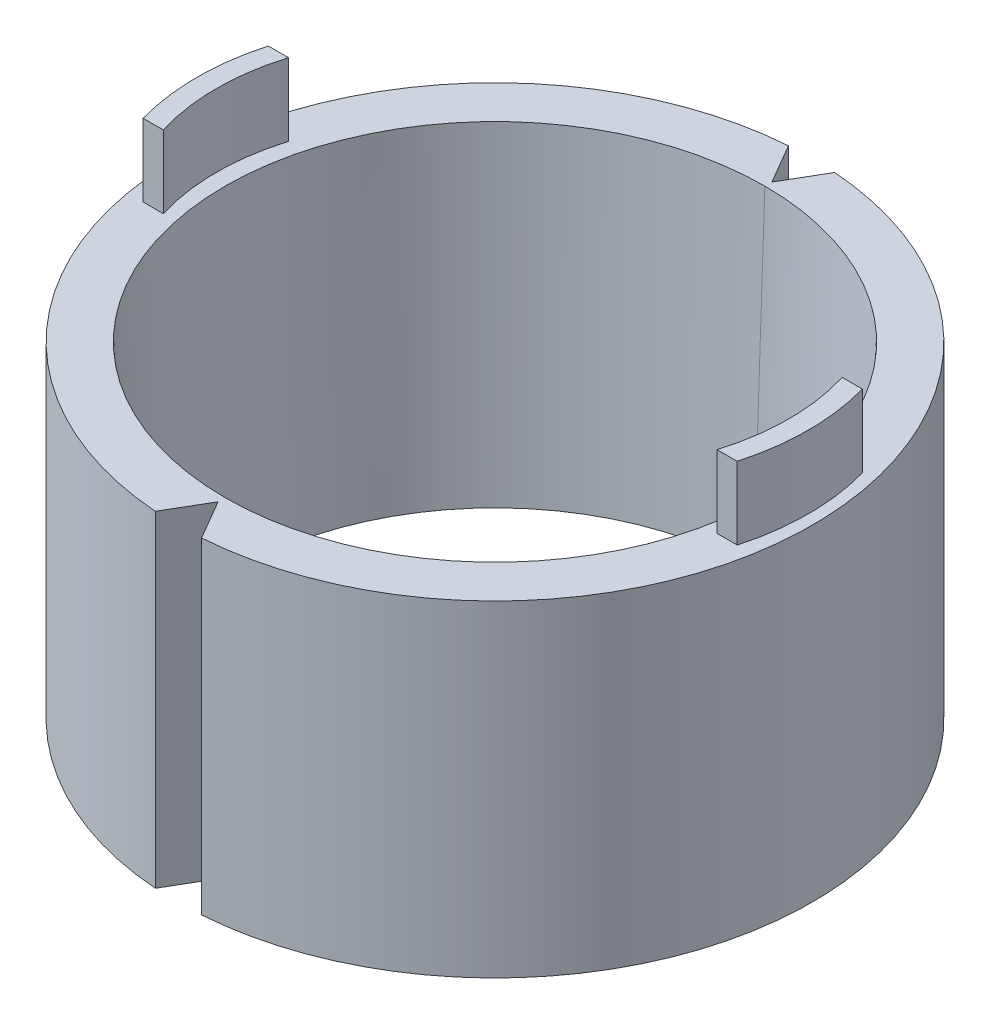
ISO-10303-21;
HEADER;
FILE_DESCRIPTION(('STEP AP214'),'2;1');
FILE_NAME('part.step','',(''),(''),'','','');
FILE_SCHEMA(('AUTOMOTIVE_DESIGN { 1 0 10303 214 1 1 1 1 }'));
ENDSEC;
DATA;
#1=APPLICATION_CONTEXT('core data for automotive mechanical design processes');
#2=APPLICATION_PROTOCOL_DEFINITION('international standard','automotive_design',2000,#1);
#3=PRODUCT_CONTEXT('',#1,'mechanical');
#4=PRODUCT('Part','Part','',(#3));
#5=PRODUCT_RELATED_PRODUCT_CATEGORY('part','',(#4));
#6=PRODUCT_DEFINITION_FORMATION('','',#4);
#7=PRODUCT_DEFINITION_CONTEXT('part definition',#1,'design');
#8=PRODUCT_DEFINITION('design','',#6,#7);
#9=PRODUCT_DEFINITION_SHAPE('','',#8);
#10=(LENGTH_UNIT() NAMED_UNIT(*) SI_UNIT(.MILLI.,.METRE.));
#11=(NAMED_UNIT(*) PLANE_ANGLE_UNIT() SI_UNIT($,.RADIAN.));
#12=(NAMED_UNIT(*) SI_UNIT($,.STERADIAN.) SOLID_ANGLE_UNIT());
#13=UNCERTAINTY_MEASURE_WITH_UNIT(LENGTH_MEASURE(1.E-05),#10,'distance_accuracy_value','');
#14=(GEOMETRIC_REPRESENTATION_CONTEXT(3) GLOBAL_UNCERTAINTY_ASSIGNED_CONTEXT((#13)) GLOBAL_UNIT_ASSIGNED_CONTEXT((#10,
#11,#12)) REPRESENTATION_CONTEXT('',''));
#15=CARTESIAN_POINT('',(0.,0.,0.));
#16=DIRECTION('',(0.,0.,1.));
#17=DIRECTION('',(1.,0.,0.));
#18=AXIS2_PLACEMENT_3D('',#15,#16,#17);
#19=CARTESIAN_POINT('',(0.,-4.,30.5339100056265));
#20=DIRECTION('',(-0.863949043618308,0.,0.50357923907863));
#21=DIRECTION('',(0.,1.,0.));
#22=AXIS2_PLACEMENT_3D('',#19,#20,#21);
#23=PLANE('',#22);
#24=DIRECTION('',(0.,1.,0.));
#25=VECTOR('',#24,1.);
#26=CARTESIAN_POINT('',(0.,-4.,30.5339100056265));
#27=LINE('',#26,#25);
#28=CARTESIAN_POINT('',(0.,0.,30.5339100056265));
#29=VERTEX_POINT('',#28);
#30=CARTESIAN_POINT('',(0.,36.,30.5339100056265));
#31=VERTEX_POINT('',#30);
#32=EDGE_CURVE('E108',#29,#31,#27,.T.);
#33=ORIENTED_EDGE('',*,*,#32,.F.);
#34=DIRECTION('',(0.50357923907863,0.,0.863949043618308));
#35=VECTOR('',#34,1.);
#36=CARTESIAN_POINT('',(0.,0.,30.5339100056265));
#37=LINE('',#36,#35);
#38=CARTESIAN_POINT('',(2.54902188416771,0.,34.9070549808207));
#39=VERTEX_POINT('',#38);
#40=EDGE_CURVE('E93',#29,#39,#37,.T.);
#41=ORIENTED_EDGE('',*,*,#40,.T.);
#42=DIRECTION('',(0.,1.,0.));
#43=VECTOR('',#42,1.);
#44=CARTESIAN_POINT('',(2.5490218841677,-4.,34.9070549808206));
#45=LINE('',#44,#43);
#46=CARTESIAN_POINT('',(2.5490218841677,36.,34.9070549808206));
#47=VERTEX_POINT('',#46);
#48=EDGE_CURVE('E106',#39,#47,#45,.T.);
#49=ORIENTED_EDGE('',*,*,#48,.T.);
#50=DIRECTION('',(0.50357923907863,0.,0.863949043618308));
#51=VECTOR('',#50,1.);
#52=CARTESIAN_POINT('',(0.,36.,30.5339100056265));
#53=LINE('',#52,#51);
#54=EDGE_CURVE('E171',#31,#47,#53,.T.);
#55=ORIENTED_EDGE('',*,*,#54,.F.);
#56=EDGE_LOOP('',(#33,#41,#49,#55));
#57=FACE_BOUND('',#56,.T.);
#58=ADVANCED_FACE('F50',(#57),#23,.T.);
#59=CARTESIAN_POINT('',(0.,-4.,30.5339100056265));
#60=DIRECTION('',(-0.863949043618308,0.,-0.50357923907863));
#61=DIRECTION('',(-0.50357923907863,0.,0.863949043618308));
#62=AXIS2_PLACEMENT_3D('',#59,#60,#61);
#63=PLANE('',#62);
#64=DIRECTION('',(-0.50357923907863,0.,0.863949043618308));
#65=VECTOR('',#64,1.);
#66=CARTESIAN_POINT('',(0.,0.,30.5339100056265));
#67=LINE('',#66,#65);
#68=CARTESIAN_POINT('',(-2.5490218841677,0.,34.9070549808207));
#69=VERTEX_POINT('',#68);
#70=EDGE_CURVE('E222',#29,#69,#67,.T.);
#71=ORIENTED_EDGE('',*,*,#70,.F.);
#72=ORIENTED_EDGE('',*,*,#32,.T.);
#73=DIRECTION('',(-0.50357923907863,0.,0.863949043618308));
#74=VECTOR('',#73,1.);
#75=CARTESIAN_POINT('',(0.,36.,30.5339100056265));
#76=LINE('',#75,#74);
#77=CARTESIAN_POINT('',(-2.5490218841677,36.,34.9070549808206));
#78=VERTEX_POINT('',#77);
#79=EDGE_CURVE('E118',#31,#78,#76,.T.);
#80=ORIENTED_EDGE('',*,*,#79,.T.);
#81=DIRECTION('',(0.,1.,0.));
#82=VECTOR('',#81,1.);
#83=CARTESIAN_POINT('',(-2.5490218841677,-4.,34.9070549808206));
#84=LINE('',#83,#82);
#85=EDGE_CURVE('E148',#69,#78,#84,.T.);
#86=ORIENTED_EDGE('',*,*,#85,.F.);
#87=EDGE_LOOP('',(#71,#72,#80,#86));
#88=FACE_BOUND('',#87,.T.);
#89=ADVANCED_FACE('F425',(#88),#63,.F.);
#90=CARTESIAN_POINT('',(0.,-4.,-30.5339100056265));
#91=DIRECTION('',(0.863949043618308,0.,0.50357923907863));
#92=DIRECTION('',(0.,-1.,0.));
#93=AXIS2_PLACEMENT_3D('',#90,#91,#92);
#94=PLANE('',#93);
#95=DIRECTION('',(0.50357923907863,0.,-0.863949043618308));
#96=VECTOR('',#95,1.);
#97=CARTESIAN_POINT('',(0.,0.,-30.5339100056265));
#98=LINE('',#97,#96);
#99=CARTESIAN_POINT('',(0.,0.,-30.5339100056265));
#100=VERTEX_POINT('',#99);
#101=CARTESIAN_POINT('',(2.5490218841677,0.,-34.9070549808207));
#102=VERTEX_POINT('',#101);
#103=EDGE_CURVE('E94',#100,#102,#98,.T.);
#104=ORIENTED_EDGE('',*,*,#103,.F.);
#105=DIRECTION('',(0.,1.,0.));
#106=VECTOR('',#105,1.);
#107=CARTESIAN_POINT('',(0.,-4.,-30.5339100056265));
#108=LINE('',#107,#106);
#109=CARTESIAN_POINT('',(0.,36.,-30.5339100056265));
#110=VERTEX_POINT('',#109);
#111=EDGE_CURVE('E132',#100,#110,#108,.T.);
#112=ORIENTED_EDGE('',*,*,#111,.T.);
#113=DIRECTION('',(0.50357923907863,0.,-0.863949043618308));
#114=VECTOR('',#113,1.);
#115=CARTESIAN_POINT('',(0.,36.,-30.5339100056265));
#116=LINE('',#115,#114);
#117=CARTESIAN_POINT('',(2.5490218841677,36.,-34.9070549808206));
#118=VERTEX_POINT('',#117);
#119=EDGE_CURVE('E133',#110,#118,#116,.T.);
#120=ORIENTED_EDGE('',*,*,#119,.T.);
#121=DIRECTION('',(0.,1.,0.));
#122=VECTOR('',#121,1.);
#123=CARTESIAN_POINT('',(2.5490218841677,-4.,-34.9070549808206));
#124=LINE('',#123,#122);
#125=EDGE_CURVE('E97',#102,#118,#124,.T.);
#126=ORIENTED_EDGE('',*,*,#125,.F.);
#127=EDGE_LOOP('',(#104,#112,#120,#126));
#128=FACE_BOUND('',#127,.T.);
#129=ADVANCED_FACE('F426',(#128),#94,.F.);
#130=CARTESIAN_POINT('',(0.,-4.,-30.5339100056265));
#131=DIRECTION('',(0.863949043618308,0.,-0.50357923907863));
#132=DIRECTION('',(0.,-1.,0.));
#133=AXIS2_PLACEMENT_3D('',#130,#131,#132);
#134=PLANE('',#133);
#135=ORIENTED_EDGE('',*,*,#111,.F.);
#136=DIRECTION('',(-0.50357923907863,0.,-0.863949043618308));
#137=VECTOR('',#136,1.);
#138=CARTESIAN_POINT('',(0.,0.,-30.5339100056265));
#139=LINE('',#138,#137);
#140=CARTESIAN_POINT('',(-2.5490218841677,0.,-34.9070549808206));
#141=VERTEX_POINT('',#140);
#142=EDGE_CURVE('E137',#100,#141,#139,.T.);
#143=ORIENTED_EDGE('',*,*,#142,.T.);
#144=DIRECTION('',(0.,1.,0.));
#145=VECTOR('',#144,1.);
#146=CARTESIAN_POINT('',(-2.5490218841677,-4.,-34.9070549808206));
#147=LINE('',#146,#145);
#148=CARTESIAN_POINT('',(-2.5490218841677,36.,-34.9070549808206));
#149=VERTEX_POINT('',#148);
#150=EDGE_CURVE('E99',#141,#149,#147,.T.);
#151=ORIENTED_EDGE('',*,*,#150,.T.);
#152=DIRECTION('',(-0.50357923907863,0.,-0.863949043618308));
#153=VECTOR('',#152,1.);
#154=CARTESIAN_POINT('',(0.,36.,-30.5339100056265));
#155=LINE('',#154,#153);
#156=EDGE_CURVE('E188',#110,#149,#155,.T.);
#157=ORIENTED_EDGE('',*,*,#156,.F.);
#158=EDGE_LOOP('',(#135,#143,#151,#157));
#159=FACE_BOUND('',#158,.T.);
#160=ADVANCED_FACE('F240',(#159),#134,.T.);
#161=CARTESIAN_POINT('',(0.,36.,0.));
#162=DIRECTION('',(0.,-1.,0.));
#163=DIRECTION('',(0.,0.,-1.));
#164=AXIS2_PLACEMENT_3D('',#161,#162,#163);
#165=CYLINDRICAL_SURFACE('',#164,35.);
#166=ORIENTED_EDGE('',*,*,#48,.F.);
#167=CARTESIAN_POINT('',(0.,0.,0.));
#168=DIRECTION('',(0.,-1.,0.));
#169=DIRECTION('',(0.,0.,-1.));
#170=AXIS2_PLACEMENT_3D('',#167,#168,#169);
#171=CIRCLE('',#170,35.);
#172=EDGE_CURVE('E86',#39,#102,#171,.F.);
#173=ORIENTED_EDGE('',*,*,#172,.T.);
#174=ORIENTED_EDGE('',*,*,#125,.T.);
#175=CARTESIAN_POINT('',(0.,36.,0.));
#176=DIRECTION('',(0.,1.,0.));
#177=DIRECTION('',(0.,0.,1.));
#178=AXIS2_PLACEMENT_3D('',#175,#176,#177);
#179=CIRCLE('',#178,35.);
#180=EDGE_CURVE('E114',#47,#118,#179,.T.);
#181=ORIENTED_EDGE('',*,*,#180,.F.);
#182=EDGE_LOOP('',(#166,#173,#174,#181));
#183=FACE_BOUND('',#182,.T.);
#184=ADVANCED_FACE('F112',(#183),#165,.T.);
#185=CARTESIAN_POINT('',(0.,36.,0.));
#186=DIRECTION('',(0.,-1.,0.));
#187=DIRECTION('',(0.,0.,-1.));
#188=AXIS2_PLACEMENT_3D('',#185,#186,#187);
#189=CYLINDRICAL_SURFACE('',#188,35.);
#190=ORIENTED_EDGE('',*,*,#150,.F.);
#191=EDGE_CURVE('E51',#141,#69,#171,.F.);
#192=ORIENTED_EDGE('',*,*,#191,.T.);
#193=ORIENTED_EDGE('',*,*,#85,.T.);
#194=CARTESIAN_POINT('',(0.,36.,0.));
#195=DIRECTION('',(0.,1.,0.));
#196=DIRECTION('',(0.,0.,1.));
#197=AXIS2_PLACEMENT_3D('',#194,#195,#196);
#198=CIRCLE('',#197,35.);
#199=EDGE_CURVE('E183',#149,#78,#198,.T.);
#200=ORIENTED_EDGE('',*,*,#199,.F.);
#201=EDGE_LOOP('',(#190,#192,#193,#200));
#202=FACE_BOUND('',#201,.T.);
#203=ADVANCED_FACE('F243',(#202),#189,.T.);
#204=CARTESIAN_POINT('',(8.10103950745609,44.,-0.854644005318987));
#205=DIRECTION('',(0.,-1.,0.));
#206=DIRECTION('',(0.,0.,-1.));
#207=AXIS2_PLACEMENT_3D('',#204,#205,#206);
#208=PLANE('',#207);
#209=DIRECTION('',(1.,0.,0.));
#210=VECTOR('',#209,1.);
#211=CARTESIAN_POINT('',(30.5308273066075,44.,-7.75611717428867));
#212=LINE('',#211,#210);
#213=CARTESIAN_POINT('',(30.5308273066075,44.,-7.75611717428867));
#214=VERTEX_POINT('',#213);
#215=CARTESIAN_POINT('',(32.7571089740171,44.,-7.75611717428867));
#216=VERTEX_POINT('',#215);
#217=EDGE_CURVE('E128',#214,#216,#212,.T.);
#218=ORIENTED_EDGE('',*,*,#217,.F.);
#219=CARTESIAN_POINT('',(7.91319699176805,44.,-0.854644005318987));
#220=DIRECTION('',(0.,-1.,0.));
#221=DIRECTION('',(0.,0.,-1.));
#222=AXIS2_PLACEMENT_3D('',#219,#220,#221);
#223=CIRCLE('',#222,23.6471464020662);
#224=CARTESIAN_POINT('',(30.5308273066075,44.,6.04682916365069));
#225=VERTEX_POINT('',#224);
#226=EDGE_CURVE('E147',#214,#225,#223,.T.);
#227=ORIENTED_EDGE('',*,*,#226,.T.);
#228=DIRECTION('',(-1.,0.,0.));
#229=VECTOR('',#228,1.);
#230=CARTESIAN_POINT('',(32.7571089740171,44.,6.04682916365069));
#231=LINE('',#230,#229);
#232=CARTESIAN_POINT('',(32.7571089740171,44.,6.04682916365069));
#233=VERTEX_POINT('',#232);
#234=EDGE_CURVE('E371',#233,#225,#231,.T.);
#235=ORIENTED_EDGE('',*,*,#234,.F.);
#236=CARTESIAN_POINT('',(8.10103950745609,44.,-0.854644005318987));
#237=DIRECTION('',(0.,-1.,0.));
#238=DIRECTION('',(0.,0.,-1.));
#239=AXIS2_PLACEMENT_3D('',#236,#237,#238);
#240=CIRCLE('',#239,25.6037515501516);
#241=EDGE_CURVE('E386',#216,#233,#240,.T.);
#242=ORIENTED_EDGE('',*,*,#241,.F.);
#243=EDGE_LOOP('',(#218,#227,#235,#242));
#244=FACE_BOUND('',#243,.T.);
#245=ADVANCED_FACE('F442',(#244),#208,.F.);
#246=CARTESIAN_POINT('',(8.10103950745609,44.,-0.854644005318987));
#247=DIRECTION('',(0.,-1.,0.));
#248=DIRECTION('',(0.,0.,-1.));
#249=AXIS2_PLACEMENT_3D('',#246,#247,#248);
#250=CYLINDRICAL_SURFACE('',#249,25.6037515501516);
#251=CARTESIAN_POINT('',(8.10103950745609,36.,-0.854644005318987));
#252=DIRECTION('',(0.,-1.,0.));
#253=DIRECTION('',(0.,0.,-1.));
#254=AXIS2_PLACEMENT_3D('',#251,#252,#253);
#255=CIRCLE('',#254,25.6037515501516);
#256=CARTESIAN_POINT('',(32.7571089740171,36.,-7.75611717428867));
#257=VERTEX_POINT('',#256);
#258=CARTESIAN_POINT('',(32.7571089740171,36.,6.04682916365069));
#259=VERTEX_POINT('',#258);
#260=EDGE_CURVE('E156',#257,#259,#255,.T.);
#261=ORIENTED_EDGE('',*,*,#260,.F.);
#262=DIRECTION('',(0.,-1.,0.));
#263=VECTOR('',#262,1.);
#264=CARTESIAN_POINT('',(32.7571089740171,44.,-7.75611717428867));
#265=LINE('',#264,#263);
#266=EDGE_CURVE('E124',#216,#257,#265,.T.);
#267=ORIENTED_EDGE('',*,*,#266,.F.);
#268=ORIENTED_EDGE('',*,*,#241,.T.);
#269=DIRECTION('',(0.,-1.,0.));
#270=VECTOR('',#269,1.);
#271=CARTESIAN_POINT('',(32.7571089740171,44.,6.04682916365069));
#272=LINE('',#271,#270);
#273=EDGE_CURVE('E369',#233,#259,#272,.T.);
#274=ORIENTED_EDGE('',*,*,#273,.T.);
#275=EDGE_LOOP('',(#261,#267,#268,#274));
#276=FACE_BOUND('',#275,.T.);
#277=ADVANCED_FACE('F441',(#276),#250,.T.);
#278=CARTESIAN_POINT('',(32.7571089740171,44.,6.04682916365069));
#279=DIRECTION('',(0.,0.,1.));
#280=DIRECTION('',(1.,0.,0.));
#281=AXIS2_PLACEMENT_3D('',#278,#279,#280);
#282=PLANE('',#281);
#283=DIRECTION('',(-1.,0.,0.));
#284=VECTOR('',#283,1.);
#285=CARTESIAN_POINT('',(32.7571089740171,36.,6.04682916365069));
#286=LINE('',#285,#284);
#287=CARTESIAN_POINT('',(30.5308273066075,36.,6.04682916365069));
#288=VERTEX_POINT('',#287);
#289=EDGE_CURVE('E151',#259,#288,#286,.T.);
#290=ORIENTED_EDGE('',*,*,#289,.F.);
#291=ORIENTED_EDGE('',*,*,#273,.F.);
#292=ORIENTED_EDGE('',*,*,#234,.T.);
#293=DIRECTION('',(0.,-1.,0.));
#294=VECTOR('',#293,1.);
#295=CARTESIAN_POINT('',(30.5308273066075,44.,6.04682916365069));
#296=LINE('',#295,#294);
#297=EDGE_CURVE('E167',#225,#288,#296,.T.);
#298=ORIENTED_EDGE('',*,*,#297,.T.);
#299=EDGE_LOOP('',(#290,#291,#292,#298));
#300=FACE_BOUND('',#299,.T.);
#301=ADVANCED_FACE('F370',(#300),#282,.T.);
#302=CARTESIAN_POINT('',(7.91319699176805,44.,-0.854644005318987));
#303=DIRECTION('',(0.,-1.,0.));
#304=DIRECTION('',(0.,0.,-1.));
#305=AXIS2_PLACEMENT_3D('',#302,#303,#304);
#306=CYLINDRICAL_SURFACE('',#305,23.6471464020662);
#307=CARTESIAN_POINT('',(7.91319699176805,36.,-0.854644005318987));
#308=DIRECTION('',(0.,-1.,0.));
#309=DIRECTION('',(0.,0.,-1.));
#310=AXIS2_PLACEMENT_3D('',#307,#308,#309);
#311=CIRCLE('',#310,23.6471464020662);
#312=CARTESIAN_POINT('',(30.5308273066075,36.,-7.75611717428867));
#313=VERTEX_POINT('',#312);
#314=EDGE_CURVE('E161',#313,#288,#311,.T.);
#315=ORIENTED_EDGE('',*,*,#314,.T.);
#316=ORIENTED_EDGE('',*,*,#297,.F.);
#317=ORIENTED_EDGE('',*,*,#226,.F.);
#318=DIRECTION('',(0.,-1.,0.));
#319=VECTOR('',#318,1.);
#320=CARTESIAN_POINT('',(30.5308273066075,44.,-7.75611717428867));
#321=LINE('',#320,#319);
#322=EDGE_CURVE('E164',#214,#313,#321,.T.);
#323=ORIENTED_EDGE('',*,*,#322,.T.);
#324=EDGE_LOOP('',(#315,#316,#317,#323));
#325=FACE_BOUND('',#324,.T.);
#326=ADVANCED_FACE('F351',(#325),#306,.F.);
#327=CARTESIAN_POINT('',(30.5308273066075,44.,-7.75611717428867));
#328=DIRECTION('',(0.,0.,-1.));
#329=DIRECTION('',(0.,-1.,0.));
#330=AXIS2_PLACEMENT_3D('',#327,#328,#329);
#331=PLANE('',#330);
#332=DIRECTION('',(1.,0.,0.));
#333=VECTOR('',#332,1.);
#334=CARTESIAN_POINT('',(30.5308273066075,36.,-7.75611717428867));
#335=LINE('',#334,#333);
#336=EDGE_CURVE('E159',#313,#257,#335,.T.);
#337=ORIENTED_EDGE('',*,*,#336,.F.);
#338=ORIENTED_EDGE('',*,*,#322,.F.);
#339=ORIENTED_EDGE('',*,*,#217,.T.);
#340=ORIENTED_EDGE('',*,*,#266,.T.);
#341=EDGE_LOOP('',(#337,#338,#339,#340));
#342=FACE_BOUND('',#341,.T.);
#343=ADVANCED_FACE('F363',(#342),#331,.T.);
#344=CARTESIAN_POINT('',(-8.10103950745609,44.,-0.854644005318987));
#345=DIRECTION('',(0.,1.,0.));
#346=DIRECTION('',(1.,0.,0.));
#347=AXIS2_PLACEMENT_3D('',#344,#345,#346);
#348=PLANE('',#347);
#349=CARTESIAN_POINT('',(-8.10103950745609,44.,-0.854644005318987));
#350=DIRECTION('',(0.,1.,0.));
#351=DIRECTION('',(0.,0.,1.));
#352=AXIS2_PLACEMENT_3D('',#349,#350,#351);
#353=CIRCLE('',#352,25.6037515501516);
#354=CARTESIAN_POINT('',(-32.7571089740171,44.,-7.75611717428867));
#355=VERTEX_POINT('',#354);
#356=CARTESIAN_POINT('',(-32.7571089740171,44.,6.04682916365069));
#357=VERTEX_POINT('',#356);
#358=EDGE_CURVE('E129',#355,#357,#353,.T.);
#359=ORIENTED_EDGE('',*,*,#358,.T.);
#360=DIRECTION('',(1.,0.,0.));
#361=VECTOR('',#360,1.);
#362=CARTESIAN_POINT('',(-32.7571089740171,44.,6.04682916365069));
#363=LINE('',#362,#361);
#364=CARTESIAN_POINT('',(-30.5308273066075,44.,6.04682916365069));
#365=VERTEX_POINT('',#364);
#366=EDGE_CURVE('E207',#357,#365,#363,.T.);
#367=ORIENTED_EDGE('',*,*,#366,.T.);
#368=CARTESIAN_POINT('',(-7.91319699176805,44.,-0.854644005318987));
#369=DIRECTION('',(0.,1.,0.));
#370=DIRECTION('',(0.,0.,1.));
#371=AXIS2_PLACEMENT_3D('',#368,#369,#370);
#372=CIRCLE('',#371,23.6471464020662);
#373=CARTESIAN_POINT('',(-30.5308273066075,44.,-7.75611717428868));
#374=VERTEX_POINT('',#373);
#375=EDGE_CURVE('E385',#374,#365,#372,.T.);
#376=ORIENTED_EDGE('',*,*,#375,.F.);
#377=DIRECTION('',(-1.,0.,0.));
#378=VECTOR('',#377,1.);
#379=CARTESIAN_POINT('',(-30.5308273066075,44.,-7.75611717428867));
#380=LINE('',#379,#378);
#381=EDGE_CURVE('E179',#374,#355,#380,.T.);
#382=ORIENTED_EDGE('',*,*,#381,.T.);
#383=EDGE_LOOP('',(#359,#367,#376,#382));
#384=FACE_BOUND('',#383,.T.);
#385=ADVANCED_FACE('F415',(#384),#348,.T.);
#386=CARTESIAN_POINT('',(-30.5308273066075,44.,-7.75611717428867));
#387=DIRECTION('',(0.,0.,1.));
#388=DIRECTION('',(1.,0.,0.));
#389=AXIS2_PLACEMENT_3D('',#386,#387,#388);
#390=PLANE('',#389);
#391=DIRECTION('',(-1.,0.,0.));
#392=VECTOR('',#391,1.);
#393=CARTESIAN_POINT('',(-30.5308273066075,36.,-7.75611717428867));
#394=LINE('',#393,#392);
#395=CARTESIAN_POINT('',(-30.5308273066075,36.,-7.75611717428868));
#396=VERTEX_POINT('',#395);
#397=CARTESIAN_POINT('',(-32.7571089740171,36.,-7.75611717428867));
#398=VERTEX_POINT('',#397);
#399=EDGE_CURVE('E173',#396,#398,#394,.T.);
#400=ORIENTED_EDGE('',*,*,#399,.T.);
#401=DIRECTION('',(0.,-1.,0.));
#402=VECTOR('',#401,1.);
#403=CARTESIAN_POINT('',(-32.7571089740171,44.,-7.75611717428867));
#404=LINE('',#403,#402);
#405=EDGE_CURVE('E139',#355,#398,#404,.T.);
#406=ORIENTED_EDGE('',*,*,#405,.F.);
#407=ORIENTED_EDGE('',*,*,#381,.F.);
#408=DIRECTION('',(0.,-1.,0.));
#409=VECTOR('',#408,1.);
#410=CARTESIAN_POINT('',(-30.5308273066075,44.,-7.75611717428868));
#411=LINE('',#410,#409);
#412=EDGE_CURVE('E177',#374,#396,#411,.T.);
#413=ORIENTED_EDGE('',*,*,#412,.T.);
#414=EDGE_LOOP('',(#400,#406,#407,#413));
#415=FACE_BOUND('',#414,.T.);
#416=ADVANCED_FACE('F406',(#415),#390,.F.);
#417=CARTESIAN_POINT('',(-7.91319699176805,44.,-0.854644005318987));
#418=DIRECTION('',(0.,-1.,0.));
#419=DIRECTION('',(0.,0.,-1.));
#420=AXIS2_PLACEMENT_3D('',#417,#418,#419);
#421=CYLINDRICAL_SURFACE('',#420,23.6471464020662);
#422=CARTESIAN_POINT('',(-7.91319699176805,36.,-0.854644005318987));
#423=DIRECTION('',(0.,1.,0.));
#424=DIRECTION('',(0.,0.,1.));
#425=AXIS2_PLACEMENT_3D('',#422,#423,#424);
#426=CIRCLE('',#425,23.6471464020662);
#427=CARTESIAN_POINT('',(-30.5308273066075,36.,6.04682916365069));
#428=VERTEX_POINT('',#427);
#429=EDGE_CURVE('E154',#396,#428,#426,.T.);
#430=ORIENTED_EDGE('',*,*,#429,.F.);
#431=ORIENTED_EDGE('',*,*,#412,.F.);
#432=ORIENTED_EDGE('',*,*,#375,.T.);
#433=DIRECTION('',(0.,-1.,0.));
#434=VECTOR('',#433,1.);
#435=CARTESIAN_POINT('',(-30.5308273066075,44.,6.04682916365069));
#436=LINE('',#435,#434);
#437=EDGE_CURVE('E220',#365,#428,#436,.T.);
#438=ORIENTED_EDGE('',*,*,#437,.T.);
#439=EDGE_LOOP('',(#430,#431,#432,#438));
#440=FACE_BOUND('',#439,.T.);
#441=ADVANCED_FACE('F411',(#440),#421,.F.);
#442=CARTESIAN_POINT('',(-32.7571089740171,44.,6.04682916365069));
#443=DIRECTION('',(0.,0.,-1.));
#444=DIRECTION('',(0.,-1.,0.));
#445=AXIS2_PLACEMENT_3D('',#442,#443,#444);
#446=PLANE('',#445);
#447=DIRECTION('',(1.,0.,0.));
#448=VECTOR('',#447,1.);
#449=CARTESIAN_POINT('',(-32.7571089740171,36.,6.04682916365069));
#450=LINE('',#449,#448);
#451=CARTESIAN_POINT('',(-32.7571089740171,36.,6.04682916365069));
#452=VERTEX_POINT('',#451);
#453=EDGE_CURVE('E213',#452,#428,#450,.T.);
#454=ORIENTED_EDGE('',*,*,#453,.T.);
#455=ORIENTED_EDGE('',*,*,#437,.F.);
#456=ORIENTED_EDGE('',*,*,#366,.F.);
#457=DIRECTION('',(0.,-1.,0.));
#458=VECTOR('',#457,1.);
#459=CARTESIAN_POINT('',(-32.7571089740171,44.,6.04682916365069));
#460=LINE('',#459,#458);
#461=EDGE_CURVE('E184',#357,#452,#460,.T.);
#462=ORIENTED_EDGE('',*,*,#461,.T.);
#463=EDGE_LOOP('',(#454,#455,#456,#462));
#464=FACE_BOUND('',#463,.T.);
#465=ADVANCED_FACE('F402',(#464),#446,.F.);
#466=CARTESIAN_POINT('',(-8.10103950745609,44.,-0.854644005318987));
#467=DIRECTION('',(0.,-1.,0.));
#468=DIRECTION('',(0.,0.,-1.));
#469=AXIS2_PLACEMENT_3D('',#466,#467,#468);
#470=CYLINDRICAL_SURFACE('',#469,25.6037515501516);
#471=CARTESIAN_POINT('',(-8.10103950745609,36.,-0.854644005318987));
#472=DIRECTION('',(0.,1.,0.));
#473=DIRECTION('',(0.,0.,1.));
#474=AXIS2_PLACEMENT_3D('',#471,#472,#473);
#475=CIRCLE('',#474,25.6037515501516);
#476=EDGE_CURVE('E144',#398,#452,#475,.T.);
#477=ORIENTED_EDGE('',*,*,#476,.T.);
#478=ORIENTED_EDGE('',*,*,#461,.F.);
#479=ORIENTED_EDGE('',*,*,#358,.F.);
#480=ORIENTED_EDGE('',*,*,#405,.T.);
#481=EDGE_LOOP('',(#477,#478,#479,#480));
#482=FACE_BOUND('',#481,.T.);
#483=ADVANCED_FACE('F410',(#482),#470,.T.);
#484=CARTESIAN_POINT('',(0.,0.,0.));
#485=DIRECTION('',(0.,1.,0.));
#486=DIRECTION('',(0.,0.,1.));
#487=AXIS2_PLACEMENT_3D('',#484,#485,#486);
#488=CONICAL_SURFACE('',#487,28.5,0.0349065850398857);
#489=DIRECTION('',(0.,0.999390827019096,-0.034899496702501));
#490=VECTOR('',#489,1.);
#491=CARTESIAN_POINT('',(0.,0.,-28.5));
#492=LINE('',#491,#490);
#493=CARTESIAN_POINT('',(0.,0.,-28.5));
#494=VERTEX_POINT('',#493);
#495=CARTESIAN_POINT('',(0.,36.,-29.757147701703));
#496=VERTEX_POINT('',#495);
#497=EDGE_CURVE('E186',#494,#496,#492,.T.);
#498=ORIENTED_EDGE('',*,*,#497,.F.);
#499=CARTESIAN_POINT('',(0.,0.,0.));
#500=DIRECTION('',(0.,1.,0.));
#501=DIRECTION('',(0.,0.,1.));
#502=AXIS2_PLACEMENT_3D('',#499,#500,#501);
#503=CIRCLE('',#502,28.5);
#504=CARTESIAN_POINT('',(0.,0.,28.5));
#505=VERTEX_POINT('',#504);
#506=EDGE_CURVE('E59',#505,#494,#503,.T.);
#507=ORIENTED_EDGE('',*,*,#506,.F.);
#508=DIRECTION('',(0.,0.999390827019096,0.034899496702501));
#509=VECTOR('',#508,1.);
#510=CARTESIAN_POINT('',(0.,0.,28.5));
#511=LINE('',#510,#509);
#512=CARTESIAN_POINT('',(0.,36.,29.757147701703));
#513=VERTEX_POINT('',#512);
#514=EDGE_CURVE('E145',#505,#513,#511,.T.);
#515=ORIENTED_EDGE('',*,*,#514,.T.);
#516=CARTESIAN_POINT('',(0.,36.,0.));
#517=DIRECTION('',(0.,1.,0.));
#518=DIRECTION('',(0.,0.,1.));
#519=AXIS2_PLACEMENT_3D('',#516,#517,#518);
#520=CIRCLE('',#519,29.757147701703);
#521=EDGE_CURVE('E170',#513,#496,#520,.T.);
#522=ORIENTED_EDGE('',*,*,#521,.T.);
#523=EDGE_LOOP('',(#498,#507,#515,#522));
#524=FACE_BOUND('',#523,.T.);
#525=ADVANCED_FACE('F433',(#524),#488,.F.);
#526=CARTESIAN_POINT('',(0.,36.,0.));
#527=DIRECTION('',(0.,1.,0.));
#528=DIRECTION('',(1.,0.,0.));
#529=AXIS2_PLACEMENT_3D('',#526,#527,#528);
#530=PLANE('',#529);
#531=ORIENTED_EDGE('',*,*,#314,.F.);
#532=ORIENTED_EDGE('',*,*,#336,.T.);
#533=ORIENTED_EDGE('',*,*,#260,.T.);
#534=ORIENTED_EDGE('',*,*,#289,.T.);
#535=EDGE_LOOP('',(#531,#532,#533,#534));
#536=FACE_BOUND('',#535,.T.);
#537=ORIENTED_EDGE('',*,*,#521,.F.);
#538=CARTESIAN_POINT('',(0.,36.,0.));
#539=DIRECTION('',(0.,1.,0.));
#540=DIRECTION('',(0.,0.,1.));
#541=AXIS2_PLACEMENT_3D('',#538,#539,#540);
#542=CIRCLE('',#541,29.757147701703);
#543=EDGE_CURVE('E203',#496,#513,#542,.T.);
#544=ORIENTED_EDGE('',*,*,#543,.F.);
#545=EDGE_LOOP('',(#537,#544));
#546=FACE_BOUND('',#545,.T.);
#547=ORIENTED_EDGE('',*,*,#476,.F.);
#548=ORIENTED_EDGE('',*,*,#399,.F.);
#549=ORIENTED_EDGE('',*,*,#429,.T.);
#550=ORIENTED_EDGE('',*,*,#453,.F.);
#551=EDGE_LOOP('',(#547,#548,#549,#550));
#552=FACE_BOUND('',#551,.T.);
#553=ORIENTED_EDGE('',*,*,#79,.F.);
#554=ORIENTED_EDGE('',*,*,#54,.T.);
#555=ORIENTED_EDGE('',*,*,#180,.T.);
#556=ORIENTED_EDGE('',*,*,#119,.F.);
#557=ORIENTED_EDGE('',*,*,#156,.T.);
#558=ORIENTED_EDGE('',*,*,#199,.T.);
#559=EDGE_LOOP('',(#553,#554,#555,#556,#557,#558));
#560=FACE_BOUND('',#559,.T.);
#561=ADVANCED_FACE('F255',(#536,#546,#552,#560),#530,.T.);
#562=CARTESIAN_POINT('',(0.,0.,0.));
#563=DIRECTION('',(0.,1.,0.));
#564=DIRECTION('',(0.,0.,1.));
#565=AXIS2_PLACEMENT_3D('',#562,#563,#564);
#566=CONICAL_SURFACE('',#565,28.5,0.0349065850398857);
#567=CARTESIAN_POINT('',(0.,0.,0.));
#568=DIRECTION('',(0.,1.,0.));
#569=DIRECTION('',(0.,0.,1.));
#570=AXIS2_PLACEMENT_3D('',#567,#568,#569);
#571=CIRCLE('',#570,28.5);
#572=EDGE_CURVE('E11',#494,#505,#571,.T.);
#573=ORIENTED_EDGE('',*,*,#572,.F.);
#574=ORIENTED_EDGE('',*,*,#497,.T.);
#575=ORIENTED_EDGE('',*,*,#543,.T.);
#576=ORIENTED_EDGE('',*,*,#514,.F.);
#577=EDGE_LOOP('',(#573,#574,#575,#576));
#578=FACE_BOUND('',#577,.T.);
#579=ADVANCED_FACE('F449',(#578),#566,.F.);
#580=CARTESIAN_POINT('',(0.,0.,0.));
#581=DIRECTION('',(0.,-1.,0.));
#582=DIRECTION('',(0.,0.,-1.));
#583=AXIS2_PLACEMENT_3D('',#580,#581,#582);
#584=PLANE('',#583);
#585=ORIENTED_EDGE('',*,*,#70,.T.);
#586=ORIENTED_EDGE('',*,*,#191,.F.);
#587=ORIENTED_EDGE('',*,*,#142,.F.);
#588=ORIENTED_EDGE('',*,*,#103,.T.);
#589=ORIENTED_EDGE('',*,*,#172,.F.);
#590=ORIENTED_EDGE('',*,*,#40,.F.);
#591=EDGE_LOOP('',(#585,#586,#587,#588,#589,#590));
#592=FACE_BOUND('',#591,.T.);
#593=ORIENTED_EDGE('',*,*,#506,.T.);
#594=ORIENTED_EDGE('',*,*,#572,.T.);
#595=EDGE_LOOP('',(#593,#594));
#596=FACE_BOUND('',#595,.T.);
#597=ADVANCED_FACE('F47',(#592,#596),#584,.T.);
#598=CLOSED_SHELL('',(#58,#89,#129,#160,#184,#203,#245,#277,#301,#326,#343,#385,#416,#441,#465,
#483,#525,#561,#579,#597));
#599=MANIFOLD_SOLID_BREP('B2',#598);
#600=ADVANCED_BREP_SHAPE_REPRESENTATION('',(#18,#599),#14);
#601=SHAPE_DEFINITION_REPRESENTATION(#9,#600);
ENDSEC;
END-ISO-10303-21;
